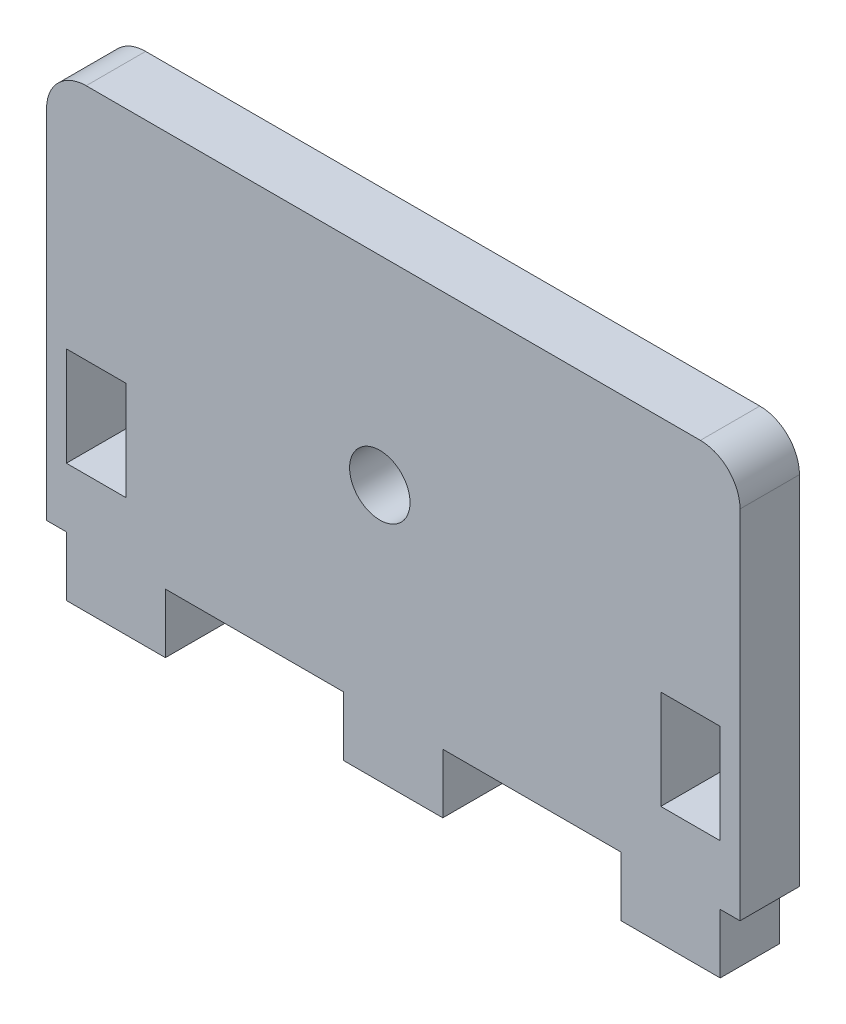
ISO-10303-21;
HEADER;
FILE_DESCRIPTION(('STEP AP214'),'2;1');
FILE_NAME('part.step','',(''),(''),'','','');
FILE_SCHEMA(('AUTOMOTIVE_DESIGN { 1 0 10303 214 1 1 1 1 }'));
ENDSEC;
DATA;
#1=APPLICATION_CONTEXT('core data for automotive mechanical design processes');
#2=APPLICATION_PROTOCOL_DEFINITION('international standard','automotive_design',2000,#1);
#3=PRODUCT_CONTEXT('',#1,'mechanical');
#4=PRODUCT('Part','Part','',(#3));
#5=PRODUCT_RELATED_PRODUCT_CATEGORY('part','',(#4));
#6=PRODUCT_DEFINITION_FORMATION('','',#4);
#7=PRODUCT_DEFINITION_CONTEXT('part definition',#1,'design');
#8=PRODUCT_DEFINITION('design','',#6,#7);
#9=PRODUCT_DEFINITION_SHAPE('','',#8);
#10=(LENGTH_UNIT() NAMED_UNIT(*) SI_UNIT(.MILLI.,.METRE.));
#11=(NAMED_UNIT(*) PLANE_ANGLE_UNIT() SI_UNIT($,.RADIAN.));
#12=(NAMED_UNIT(*) SI_UNIT($,.STERADIAN.) SOLID_ANGLE_UNIT());
#13=UNCERTAINTY_MEASURE_WITH_UNIT(LENGTH_MEASURE(1.E-05),#10,'distance_accuracy_value','');
#14=(GEOMETRIC_REPRESENTATION_CONTEXT(3) GLOBAL_UNCERTAINTY_ASSIGNED_CONTEXT((#13)) GLOBAL_UNIT_ASSIGNED_CONTEXT((#10,
#11,#12)) REPRESENTATION_CONTEXT('',''));
#15=CARTESIAN_POINT('',(0.,0.,0.));
#16=DIRECTION('',(0.,0.,1.));
#17=DIRECTION('',(1.,0.,0.));
#18=AXIS2_PLACEMENT_3D('',#15,#16,#17);
#19=CARTESIAN_POINT('',(16.5,-10.,3.));
#20=DIRECTION('',(0.,1.,0.));
#21=DIRECTION('',(0.,0.,1.));
#22=AXIS2_PLACEMENT_3D('',#19,#20,#21);
#23=PLANE('',#22);
#24=DIRECTION('',(1.,0.,0.));
#25=VECTOR('',#24,1.);
#26=CARTESIAN_POINT('',(16.5,-10.,0.));
#27=LINE('',#26,#25);
#28=CARTESIAN_POINT('',(16.5,-10.,0.));
#29=VERTEX_POINT('',#28);
#30=CARTESIAN_POINT('',(17.5,-10.,0.));
#31=VERTEX_POINT('',#30);
#32=EDGE_CURVE('E314',#29,#31,#27,.T.);
#33=ORIENTED_EDGE('',*,*,#32,.T.);
#34=DIRECTION('',(0.,0.,-1.));
#35=VECTOR('',#34,1.);
#36=CARTESIAN_POINT('',(17.5,-10.,3.));
#37=LINE('',#36,#35);
#38=CARTESIAN_POINT('',(17.5,-10.,3.));
#39=VERTEX_POINT('',#38);
#40=EDGE_CURVE('E387',#39,#31,#37,.T.);
#41=ORIENTED_EDGE('',*,*,#40,.F.);
#42=DIRECTION('',(1.,0.,0.));
#43=VECTOR('',#42,1.);
#44=CARTESIAN_POINT('',(16.5,-10.,3.));
#45=LINE('',#44,#43);
#46=CARTESIAN_POINT('',(16.5,-10.,3.));
#47=VERTEX_POINT('',#46);
#48=EDGE_CURVE('E277',#47,#39,#45,.T.);
#49=ORIENTED_EDGE('',*,*,#48,.F.);
#50=DIRECTION('',(0.,0.,-1.));
#51=VECTOR('',#50,1.);
#52=CARTESIAN_POINT('',(16.5,-10.,3.));
#53=LINE('',#52,#51);
#54=EDGE_CURVE('E313',#47,#29,#53,.T.);
#55=ORIENTED_EDGE('',*,*,#54,.T.);
#56=EDGE_LOOP('',(#33,#41,#49,#55));
#57=FACE_BOUND('',#56,.T.);
#58=ADVANCED_FACE('F33',(#57),#23,.F.);
#59=CARTESIAN_POINT('',(17.5,10.,3.));
#60=DIRECTION('',(-1.,0.,0.));
#61=DIRECTION('',(0.,-1.,0.));
#62=AXIS2_PLACEMENT_3D('',#59,#60,#61);
#63=PLANE('',#62);
#64=DIRECTION('',(0.,1.,0.));
#65=VECTOR('',#64,1.);
#66=CARTESIAN_POINT('',(17.5,10.,0.));
#67=LINE('',#66,#65);
#68=CARTESIAN_POINT('',(17.5,8.,0.));
#69=VERTEX_POINT('',#68);
#70=EDGE_CURVE('E317',#31,#69,#67,.T.);
#71=ORIENTED_EDGE('',*,*,#70,.T.);
#72=DIRECTION('',(0.,0.,-1.));
#73=VECTOR('',#72,1.);
#74=CARTESIAN_POINT('',(17.5,8.,3.));
#75=LINE('',#74,#73);
#76=CARTESIAN_POINT('',(17.5,8.,3.));
#77=VERTEX_POINT('',#76);
#78=EDGE_CURVE('E11',#69,#77,#75,.F.);
#79=ORIENTED_EDGE('',*,*,#78,.T.);
#80=DIRECTION('',(0.,1.,0.));
#81=VECTOR('',#80,1.);
#82=CARTESIAN_POINT('',(17.5,10.,3.));
#83=LINE('',#82,#81);
#84=EDGE_CURVE('E280',#39,#77,#83,.T.);
#85=ORIENTED_EDGE('',*,*,#84,.F.);
#86=ORIENTED_EDGE('',*,*,#40,.T.);
#87=EDGE_LOOP('',(#71,#79,#85,#86));
#88=FACE_BOUND('',#87,.T.);
#89=ADVANCED_FACE('F428',(#88),#63,.F.);
#90=CARTESIAN_POINT('',(-17.5,10.,3.));
#91=DIRECTION('',(0.,-1.,0.));
#92=DIRECTION('',(0.,0.,-1.));
#93=AXIS2_PLACEMENT_3D('',#90,#91,#92);
#94=PLANE('',#93);
#95=DIRECTION('',(-1.,0.,0.));
#96=VECTOR('',#95,1.);
#97=CARTESIAN_POINT('',(-17.5,10.,0.));
#98=LINE('',#97,#96);
#99=CARTESIAN_POINT('',(15.5,10.,0.));
#100=VERTEX_POINT('',#99);
#101=CARTESIAN_POINT('',(-15.5,10.,0.));
#102=VERTEX_POINT('',#101);
#103=EDGE_CURVE('E321',#100,#102,#98,.T.);
#104=ORIENTED_EDGE('',*,*,#103,.T.);
#105=DIRECTION('',(0.,0.,-1.));
#106=VECTOR('',#105,1.);
#107=CARTESIAN_POINT('',(-15.5,10.,3.));
#108=LINE('',#107,#106);
#109=CARTESIAN_POINT('',(-15.5,10.,3.));
#110=VERTEX_POINT('',#109);
#111=EDGE_CURVE('E400',#102,#110,#108,.F.);
#112=ORIENTED_EDGE('',*,*,#111,.T.);
#113=DIRECTION('',(-1.,0.,0.));
#114=VECTOR('',#113,1.);
#115=CARTESIAN_POINT('',(-17.5,10.,3.));
#116=LINE('',#115,#114);
#117=CARTESIAN_POINT('',(15.5,10.,3.));
#118=VERTEX_POINT('',#117);
#119=EDGE_CURVE('E284',#118,#110,#116,.T.);
#120=ORIENTED_EDGE('',*,*,#119,.F.);
#121=DIRECTION('',(0.,0.,-1.));
#122=VECTOR('',#121,1.);
#123=CARTESIAN_POINT('',(15.5,10.,3.));
#124=LINE('',#123,#122);
#125=EDGE_CURVE('E397',#118,#100,#124,.T.);
#126=ORIENTED_EDGE('',*,*,#125,.T.);
#127=EDGE_LOOP('',(#104,#112,#120,#126));
#128=FACE_BOUND('',#127,.T.);
#129=ADVANCED_FACE('F421',(#128),#94,.F.);
#130=CARTESIAN_POINT('',(-17.5,10.,3.));
#131=DIRECTION('',(1.,0.,0.));
#132=DIRECTION('',(0.,1.,0.));
#133=AXIS2_PLACEMENT_3D('',#130,#131,#132);
#134=PLANE('',#133);
#135=DIRECTION('',(0.,-1.,0.));
#136=VECTOR('',#135,1.);
#137=CARTESIAN_POINT('',(-17.5,10.,3.));
#138=LINE('',#137,#136);
#139=CARTESIAN_POINT('',(-17.5,8.,3.));
#140=VERTEX_POINT('',#139);
#141=CARTESIAN_POINT('',(-17.5,-10.,3.));
#142=VERTEX_POINT('',#141);
#143=EDGE_CURVE('E287',#140,#142,#138,.T.);
#144=ORIENTED_EDGE('',*,*,#143,.F.);
#145=DIRECTION('',(0.,0.,-1.));
#146=VECTOR('',#145,1.);
#147=CARTESIAN_POINT('',(-17.5,8.,3.));
#148=LINE('',#147,#146);
#149=CARTESIAN_POINT('',(-17.5,8.,0.));
#150=VERTEX_POINT('',#149);
#151=EDGE_CURVE('E390',#140,#150,#148,.T.);
#152=ORIENTED_EDGE('',*,*,#151,.T.);
#153=DIRECTION('',(0.,-1.,0.));
#154=VECTOR('',#153,1.);
#155=CARTESIAN_POINT('',(-17.5,10.,0.));
#156=LINE('',#155,#154);
#157=CARTESIAN_POINT('',(-17.5,-10.,0.));
#158=VERTEX_POINT('',#157);
#159=EDGE_CURVE('E324',#150,#158,#156,.T.);
#160=ORIENTED_EDGE('',*,*,#159,.T.);
#161=DIRECTION('',(0.,0.,-1.));
#162=VECTOR('',#161,1.);
#163=CARTESIAN_POINT('',(-17.5,-10.,3.));
#164=LINE('',#163,#162);
#165=EDGE_CURVE('E384',#142,#158,#164,.T.);
#166=ORIENTED_EDGE('',*,*,#165,.F.);
#167=EDGE_LOOP('',(#144,#152,#160,#166));
#168=FACE_BOUND('',#167,.T.);
#169=ADVANCED_FACE('F413',(#168),#134,.F.);
#170=CARTESIAN_POINT('',(-17.5,-10.,3.));
#171=DIRECTION('',(0.,1.,0.));
#172=DIRECTION('',(0.,0.,1.));
#173=AXIS2_PLACEMENT_3D('',#170,#171,#172);
#174=PLANE('',#173);
#175=DIRECTION('',(1.,0.,0.));
#176=VECTOR('',#175,1.);
#177=CARTESIAN_POINT('',(-17.5,-10.,0.));
#178=LINE('',#177,#176);
#179=CARTESIAN_POINT('',(-16.5,-10.,0.));
#180=VERTEX_POINT('',#179);
#181=EDGE_CURVE('E326',#158,#180,#178,.T.);
#182=ORIENTED_EDGE('',*,*,#181,.T.);
#183=DIRECTION('',(0.,0.,-1.));
#184=VECTOR('',#183,1.);
#185=CARTESIAN_POINT('',(-16.5,-10.,3.));
#186=LINE('',#185,#184);
#187=CARTESIAN_POINT('',(-16.5,-10.,3.));
#188=VERTEX_POINT('',#187);
#189=EDGE_CURVE('E381',#188,#180,#186,.T.);
#190=ORIENTED_EDGE('',*,*,#189,.F.);
#191=DIRECTION('',(1.,0.,0.));
#192=VECTOR('',#191,1.);
#193=CARTESIAN_POINT('',(-17.5,-10.,3.));
#194=LINE('',#193,#192);
#195=EDGE_CURVE('E289',#142,#188,#194,.T.);
#196=ORIENTED_EDGE('',*,*,#195,.F.);
#197=ORIENTED_EDGE('',*,*,#165,.T.);
#198=EDGE_LOOP('',(#182,#190,#196,#197));
#199=FACE_BOUND('',#198,.T.);
#200=ADVANCED_FACE('F489',(#199),#174,.F.);
#201=CARTESIAN_POINT('',(-16.5,-10.,3.));
#202=DIRECTION('',(1.,0.,0.));
#203=DIRECTION('',(0.,1.,0.));
#204=AXIS2_PLACEMENT_3D('',#201,#202,#203);
#205=PLANE('',#204);
#206=DIRECTION('',(0.,-1.,0.));
#207=VECTOR('',#206,1.);
#208=CARTESIAN_POINT('',(-16.5,-10.,0.));
#209=LINE('',#208,#207);
#210=CARTESIAN_POINT('',(-16.5,-13.,0.));
#211=VERTEX_POINT('',#210);
#212=EDGE_CURVE('E328',#180,#211,#209,.T.);
#213=ORIENTED_EDGE('',*,*,#212,.T.);
#214=DIRECTION('',(0.,0.,-1.));
#215=VECTOR('',#214,1.);
#216=CARTESIAN_POINT('',(-16.5,-13.,3.));
#217=LINE('',#216,#215);
#218=CARTESIAN_POINT('',(-16.5,-13.,3.));
#219=VERTEX_POINT('',#218);
#220=EDGE_CURVE('E378',#219,#211,#217,.T.);
#221=ORIENTED_EDGE('',*,*,#220,.F.);
#222=DIRECTION('',(0.,-1.,0.));
#223=VECTOR('',#222,1.);
#224=CARTESIAN_POINT('',(-16.5,-10.,3.));
#225=LINE('',#224,#223);
#226=EDGE_CURVE('E291',#188,#219,#225,.T.);
#227=ORIENTED_EDGE('',*,*,#226,.F.);
#228=ORIENTED_EDGE('',*,*,#189,.T.);
#229=EDGE_LOOP('',(#213,#221,#227,#228));
#230=FACE_BOUND('',#229,.T.);
#231=ADVANCED_FACE('F486',(#230),#205,.F.);
#232=CARTESIAN_POINT('',(-16.5,-13.,3.));
#233=DIRECTION('',(0.,1.,0.));
#234=DIRECTION('',(-1.,0.,0.));
#235=AXIS2_PLACEMENT_3D('',#232,#233,#234);
#236=PLANE('',#235);
#237=DIRECTION('',(1.,0.,0.));
#238=VECTOR('',#237,1.);
#239=CARTESIAN_POINT('',(-16.5,-13.,0.));
#240=LINE('',#239,#238);
#241=CARTESIAN_POINT('',(-11.5,-13.,0.));
#242=VERTEX_POINT('',#241);
#243=EDGE_CURVE('E330',#211,#242,#240,.T.);
#244=ORIENTED_EDGE('',*,*,#243,.T.);
#245=DIRECTION('',(0.,0.,-1.));
#246=VECTOR('',#245,1.);
#247=CARTESIAN_POINT('',(-11.5,-13.,3.));
#248=LINE('',#247,#246);
#249=CARTESIAN_POINT('',(-11.5,-13.,3.));
#250=VERTEX_POINT('',#249);
#251=EDGE_CURVE('E375',#250,#242,#248,.T.);
#252=ORIENTED_EDGE('',*,*,#251,.F.);
#253=DIRECTION('',(1.,0.,0.));
#254=VECTOR('',#253,1.);
#255=CARTESIAN_POINT('',(-16.5,-13.,3.));
#256=LINE('',#255,#254);
#257=EDGE_CURVE('E293',#219,#250,#256,.T.);
#258=ORIENTED_EDGE('',*,*,#257,.F.);
#259=ORIENTED_EDGE('',*,*,#220,.T.);
#260=EDGE_LOOP('',(#244,#252,#258,#259));
#261=FACE_BOUND('',#260,.T.);
#262=ADVANCED_FACE('F481',(#261),#236,.F.);
#263=CARTESIAN_POINT('',(-11.5,-10.,3.));
#264=DIRECTION('',(-1.,0.,0.));
#265=DIRECTION('',(0.,0.,1.));
#266=AXIS2_PLACEMENT_3D('',#263,#264,#265);
#267=PLANE('',#266);
#268=DIRECTION('',(0.,1.,0.));
#269=VECTOR('',#268,1.);
#270=CARTESIAN_POINT('',(-11.5,-10.,0.));
#271=LINE('',#270,#269);
#272=CARTESIAN_POINT('',(-11.5,-10.,0.));
#273=VERTEX_POINT('',#272);
#274=EDGE_CURVE('E332',#242,#273,#271,.T.);
#275=ORIENTED_EDGE('',*,*,#274,.T.);
#276=DIRECTION('',(0.,0.,-1.));
#277=VECTOR('',#276,1.);
#278=CARTESIAN_POINT('',(-11.5,-10.,3.));
#279=LINE('',#278,#277);
#280=CARTESIAN_POINT('',(-11.5,-10.,3.));
#281=VERTEX_POINT('',#280);
#282=EDGE_CURVE('E372',#281,#273,#279,.T.);
#283=ORIENTED_EDGE('',*,*,#282,.F.);
#284=DIRECTION('',(0.,1.,0.));
#285=VECTOR('',#284,1.);
#286=CARTESIAN_POINT('',(-11.5,-10.,3.));
#287=LINE('',#286,#285);
#288=EDGE_CURVE('E295',#250,#281,#287,.T.);
#289=ORIENTED_EDGE('',*,*,#288,.F.);
#290=ORIENTED_EDGE('',*,*,#251,.T.);
#291=EDGE_LOOP('',(#275,#283,#289,#290));
#292=FACE_BOUND('',#291,.T.);
#293=ADVANCED_FACE('F476',(#292),#267,.F.);
#294=CARTESIAN_POINT('',(-11.5,-10.,3.));
#295=DIRECTION('',(0.,1.,0.));
#296=DIRECTION('',(0.,0.,1.));
#297=AXIS2_PLACEMENT_3D('',#294,#295,#296);
#298=PLANE('',#297);
#299=DIRECTION('',(1.,0.,0.));
#300=VECTOR('',#299,1.);
#301=CARTESIAN_POINT('',(-11.5,-10.,0.));
#302=LINE('',#301,#300);
#303=CARTESIAN_POINT('',(-2.5,-10.,0.));
#304=VERTEX_POINT('',#303);
#305=EDGE_CURVE('E334',#273,#304,#302,.T.);
#306=ORIENTED_EDGE('',*,*,#305,.T.);
#307=DIRECTION('',(0.,0.,-1.));
#308=VECTOR('',#307,1.);
#309=CARTESIAN_POINT('',(-2.5,-10.,3.));
#310=LINE('',#309,#308);
#311=CARTESIAN_POINT('',(-2.5,-10.,3.));
#312=VERTEX_POINT('',#311);
#313=EDGE_CURVE('E369',#312,#304,#310,.T.);
#314=ORIENTED_EDGE('',*,*,#313,.F.);
#315=DIRECTION('',(1.,0.,0.));
#316=VECTOR('',#315,1.);
#317=CARTESIAN_POINT('',(-11.5,-10.,3.));
#318=LINE('',#317,#316);
#319=EDGE_CURVE('E297',#281,#312,#318,.T.);
#320=ORIENTED_EDGE('',*,*,#319,.F.);
#321=ORIENTED_EDGE('',*,*,#282,.T.);
#322=EDGE_LOOP('',(#306,#314,#320,#321));
#323=FACE_BOUND('',#322,.T.);
#324=ADVANCED_FACE('F472',(#323),#298,.F.);
#325=CARTESIAN_POINT('',(-2.5,-10.,3.));
#326=DIRECTION('',(1.,0.,0.));
#327=DIRECTION('',(0.,0.,-1.));
#328=AXIS2_PLACEMENT_3D('',#325,#326,#327);
#329=PLANE('',#328);
#330=DIRECTION('',(0.,-1.,0.));
#331=VECTOR('',#330,1.);
#332=CARTESIAN_POINT('',(-2.5,-10.,0.));
#333=LINE('',#332,#331);
#334=CARTESIAN_POINT('',(-2.5,-13.,0.));
#335=VERTEX_POINT('',#334);
#336=EDGE_CURVE('E336',#304,#335,#333,.T.);
#337=ORIENTED_EDGE('',*,*,#336,.T.);
#338=DIRECTION('',(0.,0.,-1.));
#339=VECTOR('',#338,1.);
#340=CARTESIAN_POINT('',(-2.5,-13.,3.));
#341=LINE('',#340,#339);
#342=CARTESIAN_POINT('',(-2.5,-13.,3.));
#343=VERTEX_POINT('',#342);
#344=EDGE_CURVE('E366',#343,#335,#341,.T.);
#345=ORIENTED_EDGE('',*,*,#344,.F.);
#346=DIRECTION('',(0.,-1.,0.));
#347=VECTOR('',#346,1.);
#348=CARTESIAN_POINT('',(-2.5,-10.,3.));
#349=LINE('',#348,#347);
#350=EDGE_CURVE('E299',#312,#343,#349,.T.);
#351=ORIENTED_EDGE('',*,*,#350,.F.);
#352=ORIENTED_EDGE('',*,*,#313,.T.);
#353=EDGE_LOOP('',(#337,#345,#351,#352));
#354=FACE_BOUND('',#353,.T.);
#355=ADVANCED_FACE('F467',(#354),#329,.F.);
#356=CARTESIAN_POINT('',(-2.5,-13.,3.));
#357=DIRECTION('',(0.,1.,0.));
#358=DIRECTION('',(0.,0.,1.));
#359=AXIS2_PLACEMENT_3D('',#356,#357,#358);
#360=PLANE('',#359);
#361=DIRECTION('',(1.,0.,0.));
#362=VECTOR('',#361,1.);
#363=CARTESIAN_POINT('',(-2.5,-13.,0.));
#364=LINE('',#363,#362);
#365=CARTESIAN_POINT('',(2.5,-13.,0.));
#366=VERTEX_POINT('',#365);
#367=EDGE_CURVE('E338',#335,#366,#364,.T.);
#368=ORIENTED_EDGE('',*,*,#367,.T.);
#369=DIRECTION('',(0.,0.,-1.));
#370=VECTOR('',#369,1.);
#371=CARTESIAN_POINT('',(2.5,-13.,3.));
#372=LINE('',#371,#370);
#373=CARTESIAN_POINT('',(2.5,-13.,3.));
#374=VERTEX_POINT('',#373);
#375=EDGE_CURVE('E363',#374,#366,#372,.T.);
#376=ORIENTED_EDGE('',*,*,#375,.F.);
#377=DIRECTION('',(1.,0.,0.));
#378=VECTOR('',#377,1.);
#379=CARTESIAN_POINT('',(-2.5,-13.,3.));
#380=LINE('',#379,#378);
#381=EDGE_CURVE('E301',#343,#374,#380,.T.);
#382=ORIENTED_EDGE('',*,*,#381,.F.);
#383=ORIENTED_EDGE('',*,*,#344,.T.);
#384=EDGE_LOOP('',(#368,#376,#382,#383));
#385=FACE_BOUND('',#384,.T.);
#386=ADVANCED_FACE('F461',(#385),#360,.F.);
#387=CARTESIAN_POINT('',(2.5,-10.,3.));
#388=DIRECTION('',(-1.,0.,0.));
#389=DIRECTION('',(0.,0.,1.));
#390=AXIS2_PLACEMENT_3D('',#387,#388,#389);
#391=PLANE('',#390);
#392=DIRECTION('',(0.,1.,0.));
#393=VECTOR('',#392,1.);
#394=CARTESIAN_POINT('',(2.5,-10.,0.));
#395=LINE('',#394,#393);
#396=CARTESIAN_POINT('',(2.5,-10.,0.));
#397=VERTEX_POINT('',#396);
#398=EDGE_CURVE('E340',#366,#397,#395,.T.);
#399=ORIENTED_EDGE('',*,*,#398,.T.);
#400=DIRECTION('',(0.,0.,-1.));
#401=VECTOR('',#400,1.);
#402=CARTESIAN_POINT('',(2.5,-10.,3.));
#403=LINE('',#402,#401);
#404=CARTESIAN_POINT('',(2.5,-10.,3.));
#405=VERTEX_POINT('',#404);
#406=EDGE_CURVE('E360',#405,#397,#403,.T.);
#407=ORIENTED_EDGE('',*,*,#406,.F.);
#408=DIRECTION('',(0.,1.,0.));
#409=VECTOR('',#408,1.);
#410=CARTESIAN_POINT('',(2.5,-10.,3.));
#411=LINE('',#410,#409);
#412=EDGE_CURVE('E303',#374,#405,#411,.T.);
#413=ORIENTED_EDGE('',*,*,#412,.F.);
#414=ORIENTED_EDGE('',*,*,#375,.T.);
#415=EDGE_LOOP('',(#399,#407,#413,#414));
#416=FACE_BOUND('',#415,.T.);
#417=ADVANCED_FACE('F457',(#416),#391,.F.);
#418=CARTESIAN_POINT('',(2.5,-10.,3.));
#419=DIRECTION('',(0.,1.,0.));
#420=DIRECTION('',(0.,0.,1.));
#421=AXIS2_PLACEMENT_3D('',#418,#419,#420);
#422=PLANE('',#421);
#423=DIRECTION('',(1.,0.,0.));
#424=VECTOR('',#423,1.);
#425=CARTESIAN_POINT('',(2.5,-10.,0.));
#426=LINE('',#425,#424);
#427=CARTESIAN_POINT('',(11.5,-10.,0.));
#428=VERTEX_POINT('',#427);
#429=EDGE_CURVE('E342',#397,#428,#426,.T.);
#430=ORIENTED_EDGE('',*,*,#429,.T.);
#431=DIRECTION('',(0.,0.,-1.));
#432=VECTOR('',#431,1.);
#433=CARTESIAN_POINT('',(11.5,-10.,3.));
#434=LINE('',#433,#432);
#435=CARTESIAN_POINT('',(11.5,-10.,3.));
#436=VERTEX_POINT('',#435);
#437=EDGE_CURVE('E357',#436,#428,#434,.T.);
#438=ORIENTED_EDGE('',*,*,#437,.F.);
#439=DIRECTION('',(1.,0.,0.));
#440=VECTOR('',#439,1.);
#441=CARTESIAN_POINT('',(2.5,-10.,3.));
#442=LINE('',#441,#440);
#443=EDGE_CURVE('E305',#405,#436,#442,.T.);
#444=ORIENTED_EDGE('',*,*,#443,.F.);
#445=ORIENTED_EDGE('',*,*,#406,.T.);
#446=EDGE_LOOP('',(#430,#438,#444,#445));
#447=FACE_BOUND('',#446,.T.);
#448=ADVANCED_FACE('F452',(#447),#422,.F.);
#449=CARTESIAN_POINT('',(11.5,-10.,3.));
#450=DIRECTION('',(1.,0.,0.));
#451=DIRECTION('',(0.,0.,-1.));
#452=AXIS2_PLACEMENT_3D('',#449,#450,#451);
#453=PLANE('',#452);
#454=DIRECTION('',(0.,-1.,0.));
#455=VECTOR('',#454,1.);
#456=CARTESIAN_POINT('',(11.5,-10.,0.));
#457=LINE('',#456,#455);
#458=CARTESIAN_POINT('',(11.5,-13.,0.));
#459=VERTEX_POINT('',#458);
#460=EDGE_CURVE('E344',#428,#459,#457,.T.);
#461=ORIENTED_EDGE('',*,*,#460,.T.);
#462=DIRECTION('',(0.,0.,-1.));
#463=VECTOR('',#462,1.);
#464=CARTESIAN_POINT('',(11.5,-13.,3.));
#465=LINE('',#464,#463);
#466=CARTESIAN_POINT('',(11.5,-13.,3.));
#467=VERTEX_POINT('',#466);
#468=EDGE_CURVE('E354',#467,#459,#465,.T.);
#469=ORIENTED_EDGE('',*,*,#468,.F.);
#470=DIRECTION('',(0.,-1.,0.));
#471=VECTOR('',#470,1.);
#472=CARTESIAN_POINT('',(11.5,-10.,3.));
#473=LINE('',#472,#471);
#474=EDGE_CURVE('E307',#436,#467,#473,.T.);
#475=ORIENTED_EDGE('',*,*,#474,.F.);
#476=ORIENTED_EDGE('',*,*,#437,.T.);
#477=EDGE_LOOP('',(#461,#469,#475,#476));
#478=FACE_BOUND('',#477,.T.);
#479=ADVANCED_FACE('F446',(#478),#453,.F.);
#480=CARTESIAN_POINT('',(11.5,-13.,3.));
#481=DIRECTION('',(0.,1.,0.));
#482=DIRECTION('',(0.,0.,1.));
#483=AXIS2_PLACEMENT_3D('',#480,#481,#482);
#484=PLANE('',#483);
#485=DIRECTION('',(1.,0.,0.));
#486=VECTOR('',#485,1.);
#487=CARTESIAN_POINT('',(11.5,-13.,0.));
#488=LINE('',#487,#486);
#489=CARTESIAN_POINT('',(16.5,-13.,0.));
#490=VERTEX_POINT('',#489);
#491=EDGE_CURVE('E346',#459,#490,#488,.T.);
#492=ORIENTED_EDGE('',*,*,#491,.T.);
#493=DIRECTION('',(0.,0.,-1.));
#494=VECTOR('',#493,1.);
#495=CARTESIAN_POINT('',(16.5,-13.,3.));
#496=LINE('',#495,#494);
#497=CARTESIAN_POINT('',(16.5,-13.,3.));
#498=VERTEX_POINT('',#497);
#499=EDGE_CURVE('E351',#498,#490,#496,.T.);
#500=ORIENTED_EDGE('',*,*,#499,.F.);
#501=DIRECTION('',(1.,0.,0.));
#502=VECTOR('',#501,1.);
#503=CARTESIAN_POINT('',(11.5,-13.,3.));
#504=LINE('',#503,#502);
#505=EDGE_CURVE('E309',#467,#498,#504,.T.);
#506=ORIENTED_EDGE('',*,*,#505,.F.);
#507=ORIENTED_EDGE('',*,*,#468,.T.);
#508=EDGE_LOOP('',(#492,#500,#506,#507));
#509=FACE_BOUND('',#508,.T.);
#510=ADVANCED_FACE('F442',(#509),#484,.F.);
#511=CARTESIAN_POINT('',(16.5,-10.,3.));
#512=DIRECTION('',(-1.,0.,0.));
#513=DIRECTION('',(0.,0.,1.));
#514=AXIS2_PLACEMENT_3D('',#511,#512,#513);
#515=PLANE('',#514);
#516=DIRECTION('',(0.,1.,0.));
#517=VECTOR('',#516,1.);
#518=CARTESIAN_POINT('',(16.5,-10.,0.));
#519=LINE('',#518,#517);
#520=EDGE_CURVE('E281',#490,#29,#519,.T.);
#521=ORIENTED_EDGE('',*,*,#520,.T.);
#522=ORIENTED_EDGE('',*,*,#54,.F.);
#523=DIRECTION('',(0.,1.,0.));
#524=VECTOR('',#523,1.);
#525=CARTESIAN_POINT('',(16.5,-10.,3.));
#526=LINE('',#525,#524);
#527=EDGE_CURVE('E311',#498,#47,#526,.T.);
#528=ORIENTED_EDGE('',*,*,#527,.F.);
#529=ORIENTED_EDGE('',*,*,#499,.T.);
#530=EDGE_LOOP('',(#521,#522,#528,#529));
#531=FACE_BOUND('',#530,.T.);
#532=ADVANCED_FACE('F437',(#531),#515,.F.);
#533=CARTESIAN_POINT('',(0.,0.,3.));
#534=DIRECTION('',(0.,0.,-1.));
#535=DIRECTION('',(-1.,0.,0.));
#536=AXIS2_PLACEMENT_3D('',#533,#534,#535);
#537=PLANE('',#536);
#538=CARTESIAN_POINT('',(-0.679999999999997,-0.0500000000000014,3.));
#539=DIRECTION('',(0.,0.,1.));
#540=DIRECTION('',(1.,0.,0.));
#541=AXIS2_PLACEMENT_3D('',#538,#539,#540);
#542=CIRCLE('',#541,1.525);
#543=CARTESIAN_POINT('',(0.845000000000003,-0.0500000000000014,3.));
#544=VERTEX_POINT('',#543);
#545=EDGE_CURVE('E232',#544,#544,#542,.T.);
#546=ORIENTED_EDGE('',*,*,#545,.F.);
#547=EDGE_LOOP('',(#546));
#548=FACE_BOUND('',#547,.T.);
#549=DIRECTION('',(1.,0.,0.));
#550=VECTOR('',#549,1.);
#551=CARTESIAN_POINT('',(-16.5,-7.,3.));
#552=LINE('',#551,#550);
#553=CARTESIAN_POINT('',(-16.5,-7.,3.));
#554=VERTEX_POINT('',#553);
#555=CARTESIAN_POINT('',(-13.5,-7.,3.));
#556=VERTEX_POINT('',#555);
#557=EDGE_CURVE('E238',#554,#556,#552,.T.);
#558=ORIENTED_EDGE('',*,*,#557,.F.);
#559=DIRECTION('',(0.,-1.,0.));
#560=VECTOR('',#559,1.);
#561=CARTESIAN_POINT('',(-16.5,-2.,3.));
#562=LINE('',#561,#560);
#563=CARTESIAN_POINT('',(-16.5,-2.,3.));
#564=VERTEX_POINT('',#563);
#565=EDGE_CURVE('E48',#564,#554,#562,.T.);
#566=ORIENTED_EDGE('',*,*,#565,.F.);
#567=DIRECTION('',(-1.,0.,0.));
#568=VECTOR('',#567,1.);
#569=CARTESIAN_POINT('',(-16.5,-2.,3.));
#570=LINE('',#569,#568);
#571=CARTESIAN_POINT('',(-13.5,-2.,3.));
#572=VERTEX_POINT('',#571);
#573=EDGE_CURVE('E226',#572,#564,#570,.T.);
#574=ORIENTED_EDGE('',*,*,#573,.F.);
#575=DIRECTION('',(0.,1.,0.));
#576=VECTOR('',#575,1.);
#577=CARTESIAN_POINT('',(-13.5,-2.,3.));
#578=LINE('',#577,#576);
#579=EDGE_CURVE('E229',#556,#572,#578,.T.);
#580=ORIENTED_EDGE('',*,*,#579,.F.);
#581=EDGE_LOOP('',(#558,#566,#574,#580));
#582=FACE_BOUND('',#581,.T.);
#583=DIRECTION('',(1.,0.,0.));
#584=VECTOR('',#583,1.);
#585=CARTESIAN_POINT('',(13.5,-7.,3.));
#586=LINE('',#585,#584);
#587=CARTESIAN_POINT('',(13.5,-7.,3.));
#588=VERTEX_POINT('',#587);
#589=CARTESIAN_POINT('',(16.5,-7.,3.));
#590=VERTEX_POINT('',#589);
#591=EDGE_CURVE('E263',#588,#590,#586,.T.);
#592=ORIENTED_EDGE('',*,*,#591,.F.);
#593=DIRECTION('',(0.,-1.,0.));
#594=VECTOR('',#593,1.);
#595=CARTESIAN_POINT('',(13.5,-2.,3.));
#596=LINE('',#595,#594);
#597=CARTESIAN_POINT('',(13.5,-2.,3.));
#598=VERTEX_POINT('',#597);
#599=EDGE_CURVE('E56',#598,#588,#596,.T.);
#600=ORIENTED_EDGE('',*,*,#599,.F.);
#601=DIRECTION('',(-1.,0.,0.));
#602=VECTOR('',#601,1.);
#603=CARTESIAN_POINT('',(13.5,-2.,3.));
#604=LINE('',#603,#602);
#605=CARTESIAN_POINT('',(16.5,-2.,3.));
#606=VERTEX_POINT('',#605);
#607=EDGE_CURVE('E252',#606,#598,#604,.T.);
#608=ORIENTED_EDGE('',*,*,#607,.F.);
#609=DIRECTION('',(0.,1.,0.));
#610=VECTOR('',#609,1.);
#611=CARTESIAN_POINT('',(16.5,-2.,3.));
#612=LINE('',#611,#610);
#613=EDGE_CURVE('E266',#590,#606,#612,.T.);
#614=ORIENTED_EDGE('',*,*,#613,.F.);
#615=EDGE_LOOP('',(#592,#600,#608,#614));
#616=FACE_BOUND('',#615,.T.);
#617=ORIENTED_EDGE('',*,*,#119,.T.);
#618=CARTESIAN_POINT('',(-15.5,8.,3.));
#619=DIRECTION('',(0.,0.,-1.));
#620=DIRECTION('',(-1.,0.,0.));
#621=AXIS2_PLACEMENT_3D('',#618,#619,#620);
#622=CIRCLE('',#621,2.);
#623=EDGE_CURVE('E41',#110,#140,#622,.F.);
#624=ORIENTED_EDGE('',*,*,#623,.T.);
#625=ORIENTED_EDGE('',*,*,#143,.T.);
#626=ORIENTED_EDGE('',*,*,#195,.T.);
#627=ORIENTED_EDGE('',*,*,#226,.T.);
#628=ORIENTED_EDGE('',*,*,#257,.T.);
#629=ORIENTED_EDGE('',*,*,#288,.T.);
#630=ORIENTED_EDGE('',*,*,#319,.T.);
#631=ORIENTED_EDGE('',*,*,#350,.T.);
#632=ORIENTED_EDGE('',*,*,#381,.T.);
#633=ORIENTED_EDGE('',*,*,#412,.T.);
#634=ORIENTED_EDGE('',*,*,#443,.T.);
#635=ORIENTED_EDGE('',*,*,#474,.T.);
#636=ORIENTED_EDGE('',*,*,#505,.T.);
#637=ORIENTED_EDGE('',*,*,#527,.T.);
#638=ORIENTED_EDGE('',*,*,#48,.T.);
#639=ORIENTED_EDGE('',*,*,#84,.T.);
#640=CARTESIAN_POINT('',(15.5,8.,3.));
#641=DIRECTION('',(0.,0.,-1.));
#642=DIRECTION('',(-1.,0.,0.));
#643=AXIS2_PLACEMENT_3D('',#640,#641,#642);
#644=CIRCLE('',#643,2.);
#645=EDGE_CURVE('E402',#77,#118,#644,.F.);
#646=ORIENTED_EDGE('',*,*,#645,.T.);
#647=EDGE_LOOP('',(#617,#624,#625,#626,#627,#628,#629,#630,#631,#632,#633,#634,#635,#636,#637,
#638,#639,#646));
#648=FACE_BOUND('',#647,.T.);
#649=ADVANCED_FACE('F406',(#548,#582,#616,#648),#537,.F.);
#650=CARTESIAN_POINT('',(0.,0.,0.));
#651=DIRECTION('',(0.,0.,-1.));
#652=DIRECTION('',(-1.,0.,0.));
#653=AXIS2_PLACEMENT_3D('',#650,#651,#652);
#654=PLANE('',#653);
#655=CARTESIAN_POINT('',(-0.679999999999997,-0.0500000000000014,0.));
#656=DIRECTION('',(0.,0.,1.));
#657=DIRECTION('',(1.,0.,0.));
#658=AXIS2_PLACEMENT_3D('',#655,#656,#657);
#659=CIRCLE('',#658,1.525);
#660=CARTESIAN_POINT('',(0.845000000000003,-0.0500000000000014,0.));
#661=VERTEX_POINT('',#660);
#662=EDGE_CURVE('E318',#661,#661,#659,.T.);
#663=ORIENTED_EDGE('',*,*,#662,.T.);
#664=EDGE_LOOP('',(#663));
#665=FACE_BOUND('',#664,.T.);
#666=DIRECTION('',(0.,-1.,0.));
#667=VECTOR('',#666,1.);
#668=CARTESIAN_POINT('',(-16.5,-2.,0.));
#669=LINE('',#668,#667);
#670=CARTESIAN_POINT('',(-16.5,-2.,0.));
#671=VERTEX_POINT('',#670);
#672=CARTESIAN_POINT('',(-16.5,-7.,0.));
#673=VERTEX_POINT('',#672);
#674=EDGE_CURVE('E207',#671,#673,#669,.T.);
#675=ORIENTED_EDGE('',*,*,#674,.T.);
#676=DIRECTION('',(1.,0.,0.));
#677=VECTOR('',#676,1.);
#678=CARTESIAN_POINT('',(-16.5,-7.,0.));
#679=LINE('',#678,#677);
#680=CARTESIAN_POINT('',(-13.5,-7.,0.));
#681=VERTEX_POINT('',#680);
#682=EDGE_CURVE('E217',#673,#681,#679,.T.);
#683=ORIENTED_EDGE('',*,*,#682,.T.);
#684=DIRECTION('',(0.,1.,0.));
#685=VECTOR('',#684,1.);
#686=CARTESIAN_POINT('',(-13.5,-2.,0.));
#687=LINE('',#686,#685);
#688=CARTESIAN_POINT('',(-13.5,-2.,0.));
#689=VERTEX_POINT('',#688);
#690=EDGE_CURVE('E221',#681,#689,#687,.T.);
#691=ORIENTED_EDGE('',*,*,#690,.T.);
#692=DIRECTION('',(-1.,0.,0.));
#693=VECTOR('',#692,1.);
#694=CARTESIAN_POINT('',(-16.5,-2.,0.));
#695=LINE('',#694,#693);
#696=EDGE_CURVE('E213',#689,#671,#695,.T.);
#697=ORIENTED_EDGE('',*,*,#696,.T.);
#698=EDGE_LOOP('',(#675,#683,#691,#697));
#699=FACE_BOUND('',#698,.T.);
#700=DIRECTION('',(0.,-1.,0.));
#701=VECTOR('',#700,1.);
#702=CARTESIAN_POINT('',(13.5,-2.,0.));
#703=LINE('',#702,#701);
#704=CARTESIAN_POINT('',(13.5,-2.,0.));
#705=VERTEX_POINT('',#704);
#706=CARTESIAN_POINT('',(13.5,-7.,0.));
#707=VERTEX_POINT('',#706);
#708=EDGE_CURVE('E248',#705,#707,#703,.T.);
#709=ORIENTED_EDGE('',*,*,#708,.T.);
#710=DIRECTION('',(1.,0.,0.));
#711=VECTOR('',#710,1.);
#712=CARTESIAN_POINT('',(13.5,-7.,0.));
#713=LINE('',#712,#711);
#714=CARTESIAN_POINT('',(16.5,-7.,0.));
#715=VERTEX_POINT('',#714);
#716=EDGE_CURVE('E251',#707,#715,#713,.T.);
#717=ORIENTED_EDGE('',*,*,#716,.T.);
#718=DIRECTION('',(0.,1.,0.));
#719=VECTOR('',#718,1.);
#720=CARTESIAN_POINT('',(16.5,-2.,0.));
#721=LINE('',#720,#719);
#722=CARTESIAN_POINT('',(16.5,-2.,0.));
#723=VERTEX_POINT('',#722);
#724=EDGE_CURVE('E255',#715,#723,#721,.T.);
#725=ORIENTED_EDGE('',*,*,#724,.T.);
#726=DIRECTION('',(-1.,0.,0.));
#727=VECTOR('',#726,1.);
#728=CARTESIAN_POINT('',(13.5,-2.,0.));
#729=LINE('',#728,#727);
#730=EDGE_CURVE('E258',#723,#705,#729,.T.);
#731=ORIENTED_EDGE('',*,*,#730,.T.);
#732=EDGE_LOOP('',(#709,#717,#725,#731));
#733=FACE_BOUND('',#732,.T.);
#734=ORIENTED_EDGE('',*,*,#159,.F.);
#735=CARTESIAN_POINT('',(-15.5,8.,0.));
#736=DIRECTION('',(0.,0.,-1.));
#737=DIRECTION('',(-1.,0.,0.));
#738=AXIS2_PLACEMENT_3D('',#735,#736,#737);
#739=CIRCLE('',#738,2.);
#740=EDGE_CURVE('E395',#150,#102,#739,.T.);
#741=ORIENTED_EDGE('',*,*,#740,.T.);
#742=ORIENTED_EDGE('',*,*,#103,.F.);
#743=CARTESIAN_POINT('',(15.5,8.,0.));
#744=DIRECTION('',(0.,0.,-1.));
#745=DIRECTION('',(-1.,0.,0.));
#746=AXIS2_PLACEMENT_3D('',#743,#744,#745);
#747=CIRCLE('',#746,2.);
#748=EDGE_CURVE('E393',#100,#69,#747,.T.);
#749=ORIENTED_EDGE('',*,*,#748,.T.);
#750=ORIENTED_EDGE('',*,*,#70,.F.);
#751=ORIENTED_EDGE('',*,*,#32,.F.);
#752=ORIENTED_EDGE('',*,*,#520,.F.);
#753=ORIENTED_EDGE('',*,*,#491,.F.);
#754=ORIENTED_EDGE('',*,*,#460,.F.);
#755=ORIENTED_EDGE('',*,*,#429,.F.);
#756=ORIENTED_EDGE('',*,*,#398,.F.);
#757=ORIENTED_EDGE('',*,*,#367,.F.);
#758=ORIENTED_EDGE('',*,*,#336,.F.);
#759=ORIENTED_EDGE('',*,*,#305,.F.);
#760=ORIENTED_EDGE('',*,*,#274,.F.);
#761=ORIENTED_EDGE('',*,*,#243,.F.);
#762=ORIENTED_EDGE('',*,*,#212,.F.);
#763=ORIENTED_EDGE('',*,*,#181,.F.);
#764=EDGE_LOOP('',(#734,#741,#742,#749,#750,#751,#752,#753,#754,#755,#756,#757,#758,#759,#760,
#761,#762,#763));
#765=FACE_BOUND('',#764,.T.);
#766=ADVANCED_FACE('F223',(#665,#699,#733,#765),#654,.T.);
#767=CARTESIAN_POINT('',(-15.5,8.,3.));
#768=DIRECTION('',(0.,0.,-1.));
#769=DIRECTION('',(-1.,0.,0.));
#770=AXIS2_PLACEMENT_3D('',#767,#768,#769);
#771=CYLINDRICAL_SURFACE('',#770,2.);
#772=ORIENTED_EDGE('',*,*,#623,.F.);
#773=ORIENTED_EDGE('',*,*,#111,.F.);
#774=ORIENTED_EDGE('',*,*,#740,.F.);
#775=ORIENTED_EDGE('',*,*,#151,.F.);
#776=EDGE_LOOP('',(#772,#773,#774,#775));
#777=FACE_BOUND('',#776,.T.);
#778=ADVANCED_FACE('F416',(#777),#771,.T.);
#779=CARTESIAN_POINT('',(15.5,8.,3.));
#780=DIRECTION('',(0.,0.,-1.));
#781=DIRECTION('',(-1.,0.,0.));
#782=AXIS2_PLACEMENT_3D('',#779,#780,#781);
#783=CYLINDRICAL_SURFACE('',#782,2.);
#784=ORIENTED_EDGE('',*,*,#645,.F.);
#785=ORIENTED_EDGE('',*,*,#78,.F.);
#786=ORIENTED_EDGE('',*,*,#748,.F.);
#787=ORIENTED_EDGE('',*,*,#125,.F.);
#788=EDGE_LOOP('',(#784,#785,#786,#787));
#789=FACE_BOUND('',#788,.T.);
#790=ADVANCED_FACE('F35',(#789),#783,.T.);
#791=CARTESIAN_POINT('',(13.5,-2.,0.));
#792=DIRECTION('',(-1.,0.,0.));
#793=DIRECTION('',(0.,-1.,0.));
#794=AXIS2_PLACEMENT_3D('',#791,#792,#793);
#795=PLANE('',#794);
#796=ORIENTED_EDGE('',*,*,#599,.T.);
#797=DIRECTION('',(0.,0.,1.));
#798=VECTOR('',#797,1.);
#799=CARTESIAN_POINT('',(13.5,-7.,0.));
#800=LINE('',#799,#798);
#801=EDGE_CURVE('E261',#707,#588,#800,.T.);
#802=ORIENTED_EDGE('',*,*,#801,.F.);
#803=ORIENTED_EDGE('',*,*,#708,.F.);
#804=DIRECTION('',(0.,0.,1.));
#805=VECTOR('',#804,1.);
#806=CARTESIAN_POINT('',(13.5,-2.,0.));
#807=LINE('',#806,#805);
#808=EDGE_CURVE('E239',#705,#598,#807,.T.);
#809=ORIENTED_EDGE('',*,*,#808,.T.);
#810=EDGE_LOOP('',(#796,#802,#803,#809));
#811=FACE_BOUND('',#810,.T.);
#812=ADVANCED_FACE('F510',(#811),#795,.F.);
#813=CARTESIAN_POINT('',(13.5,-2.,0.));
#814=DIRECTION('',(0.,1.,0.));
#815=DIRECTION('',(0.,0.,1.));
#816=AXIS2_PLACEMENT_3D('',#813,#814,#815);
#817=PLANE('',#816);
#818=ORIENTED_EDGE('',*,*,#607,.T.);
#819=ORIENTED_EDGE('',*,*,#808,.F.);
#820=ORIENTED_EDGE('',*,*,#730,.F.);
#821=DIRECTION('',(0.,0.,1.));
#822=VECTOR('',#821,1.);
#823=CARTESIAN_POINT('',(16.5,-2.,0.));
#824=LINE('',#823,#822);
#825=EDGE_CURVE('E272',#723,#606,#824,.T.);
#826=ORIENTED_EDGE('',*,*,#825,.T.);
#827=EDGE_LOOP('',(#818,#819,#820,#826));
#828=FACE_BOUND('',#827,.T.);
#829=ADVANCED_FACE('F602',(#828),#817,.F.);
#830=CARTESIAN_POINT('',(16.5,-2.,0.));
#831=DIRECTION('',(1.,0.,0.));
#832=DIRECTION('',(0.,0.,-1.));
#833=AXIS2_PLACEMENT_3D('',#830,#831,#832);
#834=PLANE('',#833);
#835=ORIENTED_EDGE('',*,*,#613,.T.);
#836=ORIENTED_EDGE('',*,*,#825,.F.);
#837=ORIENTED_EDGE('',*,*,#724,.F.);
#838=DIRECTION('',(0.,0.,1.));
#839=VECTOR('',#838,1.);
#840=CARTESIAN_POINT('',(16.5,-7.,0.));
#841=LINE('',#840,#839);
#842=EDGE_CURVE('E274',#715,#590,#841,.T.);
#843=ORIENTED_EDGE('',*,*,#842,.T.);
#844=EDGE_LOOP('',(#835,#836,#837,#843));
#845=FACE_BOUND('',#844,.T.);
#846=ADVANCED_FACE('F610',(#845),#834,.F.);
#847=CARTESIAN_POINT('',(13.5,-7.,0.));
#848=DIRECTION('',(0.,-1.,0.));
#849=DIRECTION('',(0.,0.,-1.));
#850=AXIS2_PLACEMENT_3D('',#847,#848,#849);
#851=PLANE('',#850);
#852=ORIENTED_EDGE('',*,*,#591,.T.);
#853=ORIENTED_EDGE('',*,*,#842,.F.);
#854=ORIENTED_EDGE('',*,*,#716,.F.);
#855=ORIENTED_EDGE('',*,*,#801,.T.);
#856=EDGE_LOOP('',(#852,#853,#854,#855));
#857=FACE_BOUND('',#856,.T.);
#858=ADVANCED_FACE('F620',(#857),#851,.F.);
#859=CARTESIAN_POINT('',(-16.5,-2.,0.));
#860=DIRECTION('',(-1.,0.,0.));
#861=DIRECTION('',(0.,0.,1.));
#862=AXIS2_PLACEMENT_3D('',#859,#860,#861);
#863=PLANE('',#862);
#864=ORIENTED_EDGE('',*,*,#565,.T.);
#865=DIRECTION('',(0.,0.,1.));
#866=VECTOR('',#865,1.);
#867=CARTESIAN_POINT('',(-16.5,-7.,0.));
#868=LINE('',#867,#866);
#869=EDGE_CURVE('E203',#673,#554,#868,.T.);
#870=ORIENTED_EDGE('',*,*,#869,.F.);
#871=ORIENTED_EDGE('',*,*,#674,.F.);
#872=DIRECTION('',(0.,0.,1.));
#873=VECTOR('',#872,1.);
#874=CARTESIAN_POINT('',(-16.5,-2.,0.));
#875=LINE('',#874,#873);
#876=EDGE_CURVE('E243',#671,#564,#875,.T.);
#877=ORIENTED_EDGE('',*,*,#876,.T.);
#878=EDGE_LOOP('',(#864,#870,#871,#877));
#879=FACE_BOUND('',#878,.T.);
#880=ADVANCED_FACE('F205',(#879),#863,.F.);
#881=CARTESIAN_POINT('',(-16.5,-2.,0.));
#882=DIRECTION('',(0.,1.,0.));
#883=DIRECTION('',(0.,0.,1.));
#884=AXIS2_PLACEMENT_3D('',#881,#882,#883);
#885=PLANE('',#884);
#886=ORIENTED_EDGE('',*,*,#573,.T.);
#887=ORIENTED_EDGE('',*,*,#876,.F.);
#888=ORIENTED_EDGE('',*,*,#696,.F.);
#889=DIRECTION('',(0.,0.,1.));
#890=VECTOR('',#889,1.);
#891=CARTESIAN_POINT('',(-13.5,-2.,0.));
#892=LINE('',#891,#890);
#893=EDGE_CURVE('E245',#689,#572,#892,.T.);
#894=ORIENTED_EDGE('',*,*,#893,.T.);
#895=EDGE_LOOP('',(#886,#887,#888,#894));
#896=FACE_BOUND('',#895,.T.);
#897=ADVANCED_FACE('F639',(#896),#885,.F.);
#898=CARTESIAN_POINT('',(-13.5,-2.,0.));
#899=DIRECTION('',(1.,0.,0.));
#900=DIRECTION('',(0.,1.,0.));
#901=AXIS2_PLACEMENT_3D('',#898,#899,#900);
#902=PLANE('',#901);
#903=ORIENTED_EDGE('',*,*,#579,.T.);
#904=ORIENTED_EDGE('',*,*,#893,.F.);
#905=ORIENTED_EDGE('',*,*,#690,.F.);
#906=DIRECTION('',(0.,0.,1.));
#907=VECTOR('',#906,1.);
#908=CARTESIAN_POINT('',(-13.5,-7.,0.));
#909=LINE('',#908,#907);
#910=EDGE_CURVE('E212',#681,#556,#909,.T.);
#911=ORIENTED_EDGE('',*,*,#910,.T.);
#912=EDGE_LOOP('',(#903,#904,#905,#911));
#913=FACE_BOUND('',#912,.T.);
#914=ADVANCED_FACE('F648',(#913),#902,.F.);
#915=CARTESIAN_POINT('',(-16.5,-7.,0.));
#916=DIRECTION('',(0.,-1.,0.));
#917=DIRECTION('',(0.,0.,-1.));
#918=AXIS2_PLACEMENT_3D('',#915,#916,#917);
#919=PLANE('',#918);
#920=ORIENTED_EDGE('',*,*,#557,.T.);
#921=ORIENTED_EDGE('',*,*,#910,.F.);
#922=ORIENTED_EDGE('',*,*,#682,.F.);
#923=ORIENTED_EDGE('',*,*,#869,.T.);
#924=EDGE_LOOP('',(#920,#921,#922,#923));
#925=FACE_BOUND('',#924,.T.);
#926=ADVANCED_FACE('F218',(#925),#919,.F.);
#927=CARTESIAN_POINT('',(-0.679999999999997,-0.0500000000000014,0.));
#928=DIRECTION('',(0.,0.,1.));
#929=DIRECTION('',(1.,0.,0.));
#930=AXIS2_PLACEMENT_3D('',#927,#928,#929);
#931=CYLINDRICAL_SURFACE('',#930,1.525);
#932=ORIENTED_EDGE('',*,*,#662,.F.);
#933=EDGE_LOOP('',(#932));
#934=FACE_BOUND('',#933,.T.);
#935=ORIENTED_EDGE('',*,*,#545,.T.);
#936=EDGE_LOOP('',(#935));
#937=FACE_BOUND('',#936,.T.);
#938=ADVANCED_FACE('F667',(#934,#937),#931,.F.);
#939=CLOSED_SHELL('',(#58,#89,#129,#169,#200,#231,#262,#293,#324,#355,#386,#417,#448,#479,#510,
#532,#649,#766,#778,#790,#812,#829,#846,#858,#880,#897,#914,#926,#938));
#940=MANIFOLD_SOLID_BREP('B2',#939);
#941=ADVANCED_BREP_SHAPE_REPRESENTATION('',(#18,#940),#14);
#942=SHAPE_DEFINITION_REPRESENTATION(#9,#941);
ENDSEC;
END-ISO-10303-21;
